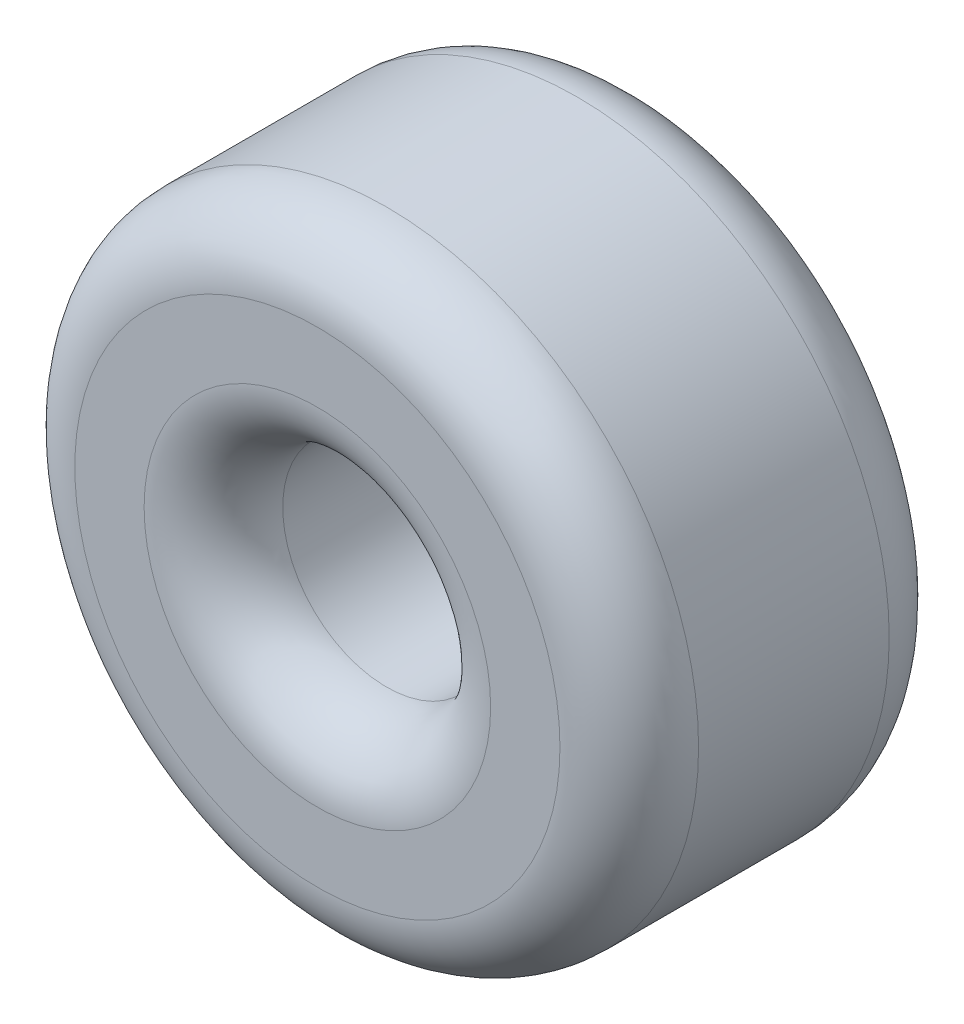
ISO-10303-21;
HEADER;
FILE_DESCRIPTION(('STEP AP214'),'2;1');
FILE_NAME('part.step','',(''),(''),'','','');
FILE_SCHEMA(('AUTOMOTIVE_DESIGN { 1 0 10303 214 1 1 1 1 }'));
ENDSEC;
DATA;
#1=APPLICATION_CONTEXT('core data for automotive mechanical design processes');
#2=APPLICATION_PROTOCOL_DEFINITION('international standard','automotive_design',2000,#1);
#3=PRODUCT_CONTEXT('',#1,'mechanical');
#4=PRODUCT('Part','Part','',(#3));
#5=PRODUCT_RELATED_PRODUCT_CATEGORY('part','',(#4));
#6=PRODUCT_DEFINITION_FORMATION('','',#4);
#7=PRODUCT_DEFINITION_CONTEXT('part definition',#1,'design');
#8=PRODUCT_DEFINITION('design','',#6,#7);
#9=PRODUCT_DEFINITION_SHAPE('','',#8);
#10=(LENGTH_UNIT() NAMED_UNIT(*) SI_UNIT(.MILLI.,.METRE.));
#11=(NAMED_UNIT(*) PLANE_ANGLE_UNIT() SI_UNIT($,.RADIAN.));
#12=(NAMED_UNIT(*) SI_UNIT($,.STERADIAN.) SOLID_ANGLE_UNIT());
#13=UNCERTAINTY_MEASURE_WITH_UNIT(LENGTH_MEASURE(1.E-05),#10,'distance_accuracy_value','');
#14=(GEOMETRIC_REPRESENTATION_CONTEXT(3) GLOBAL_UNCERTAINTY_ASSIGNED_CONTEXT((#13)) GLOBAL_UNIT_ASSIGNED_CONTEXT((#10,
#11,#12)) REPRESENTATION_CONTEXT('',''));
#15=CARTESIAN_POINT('',(0.,0.,0.));
#16=DIRECTION('',(0.,0.,1.));
#17=DIRECTION('',(1.,0.,0.));
#18=AXIS2_PLACEMENT_3D('',#15,#16,#17);
#19=CARTESIAN_POINT('',(0.,0.,4.75));
#20=DIRECTION('',(0.,0.,1.));
#21=DIRECTION('',(1.,0.,0.));
#22=AXIS2_PLACEMENT_3D('',#19,#20,#21);
#23=PLANE('',#22);
#24=CARTESIAN_POINT('',(0.,0.,4.75));
#25=DIRECTION('',(0.,0.,1.));
#26=DIRECTION('',(1.,0.,0.));
#27=AXIS2_PLACEMENT_3D('',#24,#25,#26);
#28=CIRCLE('',#27,3.5);
#29=CARTESIAN_POINT('',(3.5,0.,4.75));
#30=VERTEX_POINT('',#29);
#31=EDGE_CURVE('E10',#30,#30,#28,.T.);
#32=ORIENTED_EDGE('',*,*,#31,.T.);
#33=EDGE_LOOP('',(#32));
#34=FACE_BOUND('',#33,.T.);
#35=CARTESIAN_POINT('',(0.,0.,4.75));
#36=DIRECTION('',(0.,0.,1.));
#37=DIRECTION('',(1.,0.,0.));
#38=AXIS2_PLACEMENT_3D('',#35,#36,#37);
#39=CIRCLE('',#38,2.5);
#40=CARTESIAN_POINT('',(2.5,0.,4.75));
#41=VERTEX_POINT('',#40);
#42=EDGE_CURVE('E54',#41,#41,#39,.F.);
#43=ORIENTED_EDGE('',*,*,#42,.T.);
#44=EDGE_LOOP('',(#43));
#45=FACE_BOUND('',#44,.T.);
#46=ADVANCED_FACE('F34',(#34,#45),#23,.T.);
#47=CARTESIAN_POINT('',(0.,0.,0.));
#48=DIRECTION('',(0.,0.,1.));
#49=DIRECTION('',(1.,0.,0.));
#50=AXIS2_PLACEMENT_3D('',#47,#48,#49);
#51=PLANE('',#50);
#52=CARTESIAN_POINT('',(0.,0.,0.));
#53=DIRECTION('',(0.,0.,1.));
#54=DIRECTION('',(1.,0.,0.));
#55=AXIS2_PLACEMENT_3D('',#52,#53,#54);
#56=CIRCLE('',#55,3.5);
#57=CARTESIAN_POINT('',(3.5,0.,0.));
#58=VERTEX_POINT('',#57);
#59=EDGE_CURVE('E41',#58,#58,#56,.F.);
#60=ORIENTED_EDGE('',*,*,#59,.T.);
#61=EDGE_LOOP('',(#60));
#62=FACE_BOUND('',#61,.T.);
#63=CARTESIAN_POINT('',(0.,0.,0.));
#64=DIRECTION('',(0.,0.,1.));
#65=DIRECTION('',(1.,0.,0.));
#66=AXIS2_PLACEMENT_3D('',#63,#64,#65);
#67=CIRCLE('',#66,2.5);
#68=CARTESIAN_POINT('',(2.5,0.,0.));
#69=VERTEX_POINT('',#68);
#70=EDGE_CURVE('E63',#69,#69,#67,.T.);
#71=ORIENTED_EDGE('',*,*,#70,.T.);
#72=EDGE_LOOP('',(#71));
#73=FACE_BOUND('',#72,.T.);
#74=ADVANCED_FACE('F67',(#62,#73),#51,.F.);
#75=CARTESIAN_POINT('',(0.,0.,4.75));
#76=DIRECTION('',(0.,0.,-1.));
#77=DIRECTION('',(-1.,0.,0.));
#78=AXIS2_PLACEMENT_3D('',#75,#76,#77);
#79=CYLINDRICAL_SURFACE('',#78,4.5);
#80=CARTESIAN_POINT('',(0.,0.,1.));
#81=DIRECTION('',(0.,0.,1.));
#82=DIRECTION('',(1.,0.,0.));
#83=AXIS2_PLACEMENT_3D('',#80,#81,#82);
#84=CIRCLE('',#83,4.5);
#85=CARTESIAN_POINT('',(4.5,0.,1.));
#86=VERTEX_POINT('',#85);
#87=EDGE_CURVE('E45',#86,#86,#84,.T.);
#88=ORIENTED_EDGE('',*,*,#87,.T.);
#89=EDGE_LOOP('',(#88));
#90=FACE_BOUND('',#89,.T.);
#91=CARTESIAN_POINT('',(0.,0.,3.75));
#92=DIRECTION('',(0.,0.,1.));
#93=DIRECTION('',(1.,0.,0.));
#94=AXIS2_PLACEMENT_3D('',#91,#92,#93);
#95=CIRCLE('',#94,4.5);
#96=CARTESIAN_POINT('',(4.5,0.,3.75));
#97=VERTEX_POINT('',#96);
#98=EDGE_CURVE('E49',#97,#97,#95,.F.);
#99=ORIENTED_EDGE('',*,*,#98,.T.);
#100=EDGE_LOOP('',(#99));
#101=FACE_BOUND('',#100,.T.);
#102=ADVANCED_FACE('F82',(#90,#101),#79,.T.);
#103=CARTESIAN_POINT('',(0.,0.,4.75));
#104=DIRECTION('',(0.,0.,-1.));
#105=DIRECTION('',(-1.,0.,0.));
#106=AXIS2_PLACEMENT_3D('',#103,#104,#105);
#107=CYLINDRICAL_SURFACE('',#106,1.5);
#108=CARTESIAN_POINT('',(0.,0.,1.));
#109=DIRECTION('',(0.,0.,1.));
#110=DIRECTION('',(1.,0.,0.));
#111=AXIS2_PLACEMENT_3D('',#108,#109,#110);
#112=CIRCLE('',#111,1.5);
#113=CARTESIAN_POINT('',(1.5,0.,1.));
#114=VERTEX_POINT('',#113);
#115=EDGE_CURVE('E57',#114,#114,#112,.F.);
#116=ORIENTED_EDGE('',*,*,#115,.T.);
#117=EDGE_LOOP('',(#116));
#118=FACE_BOUND('',#117,.T.);
#119=CARTESIAN_POINT('',(0.,0.,3.75));
#120=DIRECTION('',(0.,0.,1.));
#121=DIRECTION('',(1.,0.,0.));
#122=AXIS2_PLACEMENT_3D('',#119,#120,#121);
#123=CIRCLE('',#122,1.5);
#124=CARTESIAN_POINT('',(1.5,0.,3.75));
#125=VERTEX_POINT('',#124);
#126=EDGE_CURVE('E60',#125,#125,#123,.T.);
#127=ORIENTED_EDGE('',*,*,#126,.T.);
#128=EDGE_LOOP('',(#127));
#129=FACE_BOUND('',#128,.T.);
#130=ADVANCED_FACE('F72',(#118,#129),#107,.F.);
#131=CARTESIAN_POINT('',(0.,0.,1.));
#132=DIRECTION('',(0.,0.,1.));
#133=DIRECTION('',(1.,0.,0.));
#134=AXIS2_PLACEMENT_3D('',#131,#132,#133);
#135=TOROIDAL_SURFACE('',#134,2.5,1.);
#136=ORIENTED_EDGE('',*,*,#115,.F.);
#137=EDGE_LOOP('',(#136));
#138=FACE_BOUND('',#137,.T.);
#139=ORIENTED_EDGE('',*,*,#70,.F.);
#140=EDGE_LOOP('',(#139));
#141=FACE_BOUND('',#140,.T.);
#142=ADVANCED_FACE('F69',(#138,#141),#135,.T.);
#143=CARTESIAN_POINT('',(0.,0.,3.75));
#144=DIRECTION('',(0.,0.,1.));
#145=DIRECTION('',(1.,0.,0.));
#146=AXIS2_PLACEMENT_3D('',#143,#144,#145);
#147=TOROIDAL_SURFACE('',#146,2.5,1.);
#148=ORIENTED_EDGE('',*,*,#42,.F.);
#149=EDGE_LOOP('',(#148));
#150=FACE_BOUND('',#149,.T.);
#151=ORIENTED_EDGE('',*,*,#126,.F.);
#152=EDGE_LOOP('',(#151));
#153=FACE_BOUND('',#152,.T.);
#154=ADVANCED_FACE('F71',(#150,#153),#147,.T.);
#155=CARTESIAN_POINT('',(0.,0.,1.));
#156=DIRECTION('',(0.,0.,1.));
#157=DIRECTION('',(1.,0.,0.));
#158=AXIS2_PLACEMENT_3D('',#155,#156,#157);
#159=TOROIDAL_SURFACE('',#158,3.5,1.);
#160=ORIENTED_EDGE('',*,*,#59,.F.);
#161=EDGE_LOOP('',(#160));
#162=FACE_BOUND('',#161,.T.);
#163=ORIENTED_EDGE('',*,*,#87,.F.);
#164=EDGE_LOOP('',(#163));
#165=FACE_BOUND('',#164,.T.);
#166=ADVANCED_FACE('F79',(#162,#165),#159,.T.);
#167=CARTESIAN_POINT('',(0.,0.,3.75));
#168=DIRECTION('',(0.,0.,1.));
#169=DIRECTION('',(1.,0.,0.));
#170=AXIS2_PLACEMENT_3D('',#167,#168,#169);
#171=TOROIDAL_SURFACE('',#170,3.5,1.);
#172=ORIENTED_EDGE('',*,*,#98,.F.);
#173=EDGE_LOOP('',(#172));
#174=FACE_BOUND('',#173,.T.);
#175=ORIENTED_EDGE('',*,*,#31,.F.);
#176=EDGE_LOOP('',(#175));
#177=FACE_BOUND('',#176,.T.);
#178=ADVANCED_FACE('F36',(#174,#177),#171,.T.);
#179=CLOSED_SHELL('',(#46,#74,#102,#130,#142,#154,#166,#178));
#180=MANIFOLD_SOLID_BREP('B2',#179);
#181=ADVANCED_BREP_SHAPE_REPRESENTATION('',(#18,#180),#14);
#182=SHAPE_DEFINITION_REPRESENTATION(#9,#181);
ENDSEC;
END-ISO-10303-21;
